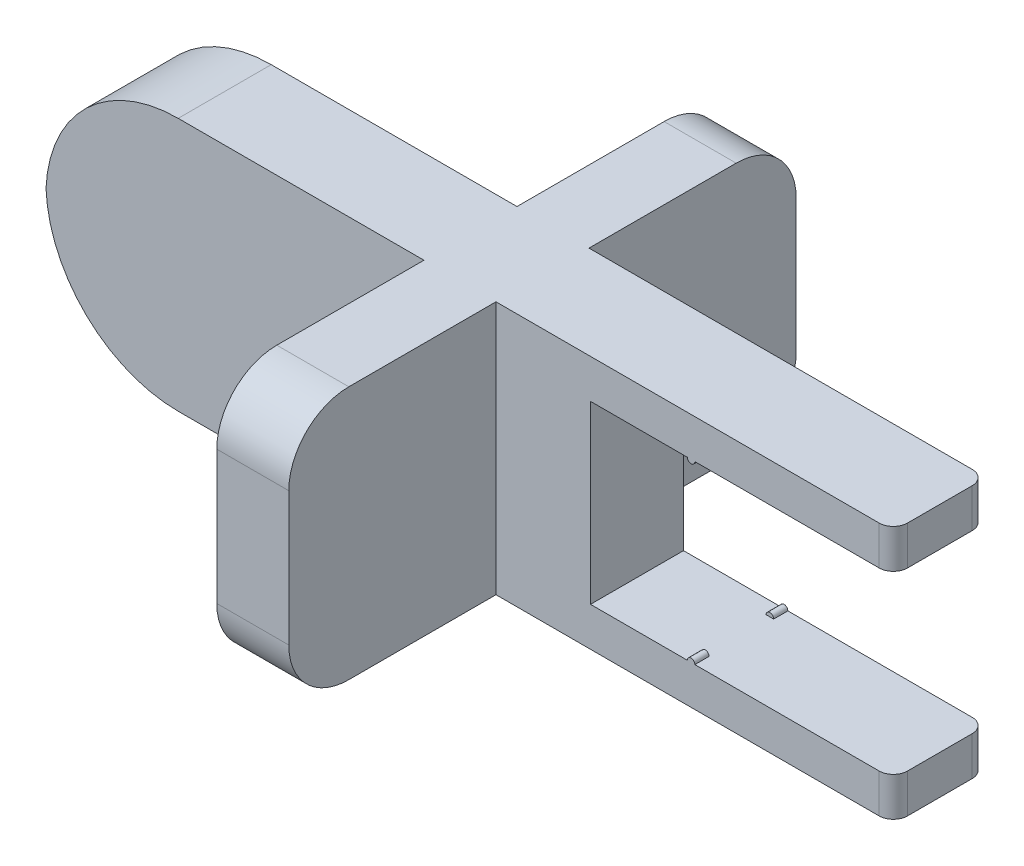
ISO-10303-21;
HEADER;
FILE_DESCRIPTION(('STEP AP214'),'2;1');
FILE_NAME('part.step','',(''),(''),'','','');
FILE_SCHEMA(('AUTOMOTIVE_DESIGN { 1 0 10303 214 1 1 1 1 }'));
ENDSEC;
DATA;
#1=APPLICATION_CONTEXT('core data for automotive mechanical design processes');
#2=APPLICATION_PROTOCOL_DEFINITION('international standard','automotive_design',2000,#1);
#3=PRODUCT_CONTEXT('',#1,'mechanical');
#4=PRODUCT('Part','Part','',(#3));
#5=PRODUCT_RELATED_PRODUCT_CATEGORY('part','',(#4));
#6=PRODUCT_DEFINITION_FORMATION('','',#4);
#7=PRODUCT_DEFINITION_CONTEXT('part definition',#1,'design');
#8=PRODUCT_DEFINITION('design','',#6,#7);
#9=PRODUCT_DEFINITION_SHAPE('','',#8);
#10=(LENGTH_UNIT() NAMED_UNIT(*) SI_UNIT(.MILLI.,.METRE.));
#11=(NAMED_UNIT(*) PLANE_ANGLE_UNIT() SI_UNIT($,.RADIAN.));
#12=(NAMED_UNIT(*) SI_UNIT($,.STERADIAN.) SOLID_ANGLE_UNIT());
#13=UNCERTAINTY_MEASURE_WITH_UNIT(LENGTH_MEASURE(1.E-05),#10,'distance_accuracy_value','');
#14=(GEOMETRIC_REPRESENTATION_CONTEXT(3) GLOBAL_UNCERTAINTY_ASSIGNED_CONTEXT((#13)) GLOBAL_UNIT_ASSIGNED_CONTEXT((#10,
#11,#12)) REPRESENTATION_CONTEXT('',''));
#15=CARTESIAN_POINT('',(0.,0.,0.));
#16=DIRECTION('',(0.,0.,1.));
#17=DIRECTION('',(1.,0.,0.));
#18=AXIS2_PLACEMENT_3D('',#15,#16,#17);
#19=CARTESIAN_POINT('',(-3.81,3.535,-7.785));
#20=DIRECTION('',(-1.,0.,0.));
#21=DIRECTION('',(0.,0.,1.));
#22=AXIS2_PLACEMENT_3D('',#19,#20,#21);
#23=PLANE('',#22);
#24=DIRECTION('',(0.,-1.,0.));
#25=VECTOR('',#24,1.);
#26=CARTESIAN_POINT('',(-3.81,-6.71,0.));
#27=LINE('',#26,#25);
#28=CARTESIAN_POINT('',(-3.81,6.71,0.));
#29=VERTEX_POINT('',#28);
#30=CARTESIAN_POINT('',(-3.81,-6.71,0.));
#31=VERTEX_POINT('',#30);
#32=EDGE_CURVE('E270',#29,#31,#27,.T.);
#33=ORIENTED_EDGE('',*,*,#32,.F.);
#34=DIRECTION('',(0.,0.,-1.));
#35=VECTOR('',#34,1.);
#36=CARTESIAN_POINT('',(-3.81,6.71,12.705));
#37=LINE('',#36,#35);
#38=CARTESIAN_POINT('',(-3.81,6.71,-7.78499999999998));
#39=VERTEX_POINT('',#38);
#40=EDGE_CURVE('E266',#29,#39,#37,.T.);
#41=ORIENTED_EDGE('',*,*,#40,.T.);
#42=CARTESIAN_POINT('',(-3.81,3.535,-7.785));
#43=DIRECTION('',(-1.,0.,0.));
#44=DIRECTION('',(0.,0.,1.));
#45=AXIS2_PLACEMENT_3D('',#42,#43,#44);
#46=CIRCLE('',#45,3.175);
#47=CARTESIAN_POINT('',(-3.81,3.53499999999998,-10.96));
#48=VERTEX_POINT('',#47);
#49=EDGE_CURVE('E280',#39,#48,#46,.T.);
#50=ORIENTED_EDGE('',*,*,#49,.T.);
#51=DIRECTION('',(0.,-1.,0.));
#52=VECTOR('',#51,1.);
#53=CARTESIAN_POINT('',(-3.81,-3.53499999999998,-10.96));
#54=LINE('',#53,#52);
#55=CARTESIAN_POINT('',(-3.81,-3.535,-10.96));
#56=VERTEX_POINT('',#55);
#57=EDGE_CURVE('E283',#48,#56,#54,.T.);
#58=ORIENTED_EDGE('',*,*,#57,.T.);
#59=CARTESIAN_POINT('',(-3.81,-3.535,-7.785));
#60=DIRECTION('',(-1.,0.,0.));
#61=DIRECTION('',(0.,0.,-1.));
#62=AXIS2_PLACEMENT_3D('',#59,#60,#61);
#63=CIRCLE('',#62,3.175);
#64=CARTESIAN_POINT('',(-3.81,-6.71,-7.78499999999998));
#65=VERTEX_POINT('',#64);
#66=EDGE_CURVE('E286',#56,#65,#63,.T.);
#67=ORIENTED_EDGE('',*,*,#66,.T.);
#68=DIRECTION('',(0.,0.,1.));
#69=VECTOR('',#68,1.);
#70=CARTESIAN_POINT('',(-3.81,-6.71,12.705));
#71=LINE('',#70,#69);
#72=EDGE_CURVE('E289',#65,#31,#71,.T.);
#73=ORIENTED_EDGE('',*,*,#72,.T.);
#74=EDGE_LOOP('',(#33,#41,#50,#58,#67,#73));
#75=FACE_BOUND('',#74,.T.);
#76=ADVANCED_FACE('F33',(#75),#23,.T.);
#77=CARTESIAN_POINT('',(10.32,-4.64999999999999,4.92));
#78=DIRECTION('',(0.,0.,-1.));
#79=DIRECTION('',(-1.,0.,0.));
#80=AXIS2_PLACEMENT_3D('',#77,#78,#79);
#81=CYLINDRICAL_SURFACE('',#80,0.199999999999996);
#82=CARTESIAN_POINT('',(10.32,-4.64999999999999,4.17));
#83=DIRECTION('',(0.,0.,1.));
#84=DIRECTION('',(1.,0.,0.));
#85=AXIS2_PLACEMENT_3D('',#82,#83,#84);
#86=CIRCLE('',#85,0.199999999999996);
#87=CARTESIAN_POINT('',(10.12,-4.64999999999998,4.17));
#88=VERTEX_POINT('',#87);
#89=CARTESIAN_POINT('',(10.52,-4.64999999999999,4.17));
#90=VERTEX_POINT('',#89);
#91=EDGE_CURVE('E353',#88,#90,#86,.F.);
#92=ORIENTED_EDGE('',*,*,#91,.F.);
#93=DIRECTION('',(0.,0.,-1.));
#94=VECTOR('',#93,1.);
#95=CARTESIAN_POINT('',(10.12,-4.64999999999999,4.92));
#96=LINE('',#95,#94);
#97=CARTESIAN_POINT('',(10.12,-4.64999999999999,4.92));
#98=VERTEX_POINT('',#97);
#99=EDGE_CURVE('E454',#98,#88,#96,.T.);
#100=ORIENTED_EDGE('',*,*,#99,.F.);
#101=CARTESIAN_POINT('',(10.32,-4.64999999999999,4.92));
#102=DIRECTION('',(0.,0.,-1.));
#103=DIRECTION('',(-1.,0.,0.));
#104=AXIS2_PLACEMENT_3D('',#101,#102,#103);
#105=CIRCLE('',#104,0.199999999999996);
#106=CARTESIAN_POINT('',(10.52,-4.64999999999999,4.92));
#107=VERTEX_POINT('',#106);
#108=EDGE_CURVE('E413',#98,#107,#105,.T.);
#109=ORIENTED_EDGE('',*,*,#108,.T.);
#110=DIRECTION('',(0.,0.,-1.));
#111=VECTOR('',#110,1.);
#112=CARTESIAN_POINT('',(10.52,-4.64999999999999,4.92));
#113=LINE('',#112,#111);
#114=EDGE_CURVE('E450',#107,#90,#113,.T.);
#115=ORIENTED_EDGE('',*,*,#114,.T.);
#116=EDGE_LOOP('',(#92,#100,#109,#115));
#117=FACE_BOUND('',#116,.T.);
#118=ADVANCED_FACE('F544',(#117),#81,.T.);
#119=CARTESIAN_POINT('',(10.32,4.64999999999999,4.92));
#120=DIRECTION('',(0.,0.,-1.));
#121=DIRECTION('',(-1.,0.,0.));
#122=AXIS2_PLACEMENT_3D('',#119,#120,#121);
#123=CYLINDRICAL_SURFACE('',#122,0.199999999999994);
#124=CARTESIAN_POINT('',(10.32,4.64999999999999,4.17));
#125=DIRECTION('',(0.,0.,1.));
#126=DIRECTION('',(1.,0.,0.));
#127=AXIS2_PLACEMENT_3D('',#124,#125,#126);
#128=CIRCLE('',#127,0.199999999999994);
#129=CARTESIAN_POINT('',(10.52,4.65000000000002,4.17));
#130=VERTEX_POINT('',#129);
#131=CARTESIAN_POINT('',(10.12,4.65000000000002,4.17));
#132=VERTEX_POINT('',#131);
#133=EDGE_CURVE('E351',#130,#132,#128,.F.);
#134=ORIENTED_EDGE('',*,*,#133,.F.);
#135=DIRECTION('',(0.,0.,-1.));
#136=VECTOR('',#135,1.);
#137=CARTESIAN_POINT('',(10.52,4.65,4.92));
#138=LINE('',#137,#136);
#139=CARTESIAN_POINT('',(10.52,4.65,4.92));
#140=VERTEX_POINT('',#139);
#141=EDGE_CURVE('E466',#140,#130,#138,.T.);
#142=ORIENTED_EDGE('',*,*,#141,.F.);
#143=CARTESIAN_POINT('',(10.32,4.64999999999999,4.92));
#144=DIRECTION('',(0.,0.,-1.));
#145=DIRECTION('',(-1.,0.,0.));
#146=AXIS2_PLACEMENT_3D('',#143,#144,#145);
#147=CIRCLE('',#146,0.199999999999994);
#148=CARTESIAN_POINT('',(10.12,4.64999999999999,4.92));
#149=VERTEX_POINT('',#148);
#150=EDGE_CURVE('E402',#140,#149,#147,.T.);
#151=ORIENTED_EDGE('',*,*,#150,.T.);
#152=DIRECTION('',(0.,0.,-1.));
#153=VECTOR('',#152,1.);
#154=CARTESIAN_POINT('',(10.12,4.64999999999999,4.92));
#155=LINE('',#154,#153);
#156=EDGE_CURVE('E462',#149,#132,#155,.T.);
#157=ORIENTED_EDGE('',*,*,#156,.T.);
#158=EDGE_LOOP('',(#134,#142,#151,#157));
#159=FACE_BOUND('',#158,.T.);
#160=ADVANCED_FACE('F562',(#159),#123,.T.);
#161=CARTESIAN_POINT('',(21.02,-4.64999999999999,4.92));
#162=DIRECTION('',(1.,0.,0.));
#163=DIRECTION('',(0.,1.,0.));
#164=AXIS2_PLACEMENT_3D('',#161,#162,#163);
#165=PLANE('',#164);
#166=DIRECTION('',(0.,1.,0.));
#167=VECTOR('',#166,1.);
#168=CARTESIAN_POINT('',(21.02,-19.9546229441366,0.75));
#169=LINE('',#168,#167);
#170=CARTESIAN_POINT('',(21.02,-6.70999999999999,0.75));
#171=VERTEX_POINT('',#170);
#172=CARTESIAN_POINT('',(21.02,-4.64999999999999,0.75));
#173=VERTEX_POINT('',#172);
#174=EDGE_CURVE('E376',#171,#173,#169,.T.);
#175=ORIENTED_EDGE('',*,*,#174,.T.);
#176=DIRECTION('',(0.,0.,-1.));
#177=VECTOR('',#176,1.);
#178=CARTESIAN_POINT('',(21.02,-4.64999999999999,4.92));
#179=LINE('',#178,#177);
#180=CARTESIAN_POINT('',(21.02,-4.64999999999999,4.17));
#181=VERTEX_POINT('',#180);
#182=EDGE_CURVE('E447',#181,#173,#179,.T.);
#183=ORIENTED_EDGE('',*,*,#182,.F.);
#184=DIRECTION('',(0.,1.,0.));
#185=VECTOR('',#184,1.);
#186=CARTESIAN_POINT('',(21.02,-19.9546229441366,4.17));
#187=LINE('',#186,#185);
#188=CARTESIAN_POINT('',(21.02,-6.70999999999999,4.17));
#189=VERTEX_POINT('',#188);
#190=EDGE_CURVE('E366',#189,#181,#187,.T.);
#191=ORIENTED_EDGE('',*,*,#190,.F.);
#192=DIRECTION('',(0.,0.,-1.));
#193=VECTOR('',#192,1.);
#194=CARTESIAN_POINT('',(21.02,-6.70999999999999,4.92));
#195=LINE('',#194,#193);
#196=EDGE_CURVE('E443',#189,#171,#195,.T.);
#197=ORIENTED_EDGE('',*,*,#196,.T.);
#198=EDGE_LOOP('',(#175,#183,#191,#197));
#199=FACE_BOUND('',#198,.T.);
#200=ADVANCED_FACE('F526',(#199),#165,.T.);
#201=CARTESIAN_POINT('',(21.02,6.71,4.92));
#202=DIRECTION('',(1.,0.,0.));
#203=DIRECTION('',(0.,1.,0.));
#204=AXIS2_PLACEMENT_3D('',#201,#202,#203);
#205=PLANE('',#204);
#206=CARTESIAN_POINT('',(21.02,4.65,0.75));
#207=VERTEX_POINT('',#206);
#208=CARTESIAN_POINT('',(21.02,6.71,0.75));
#209=VERTEX_POINT('',#208);
#210=EDGE_CURVE('E370',#207,#209,#169,.T.);
#211=ORIENTED_EDGE('',*,*,#210,.T.);
#212=DIRECTION('',(0.,0.,-1.));
#213=VECTOR('',#212,1.);
#214=CARTESIAN_POINT('',(21.02,6.71,4.92));
#215=LINE('',#214,#213);
#216=CARTESIAN_POINT('',(21.02,6.71,4.17));
#217=VERTEX_POINT('',#216);
#218=EDGE_CURVE('E418',#217,#209,#215,.T.);
#219=ORIENTED_EDGE('',*,*,#218,.F.);
#220=CARTESIAN_POINT('',(21.02,4.65,4.17));
#221=VERTEX_POINT('',#220);
#222=EDGE_CURVE('E375',#221,#217,#187,.T.);
#223=ORIENTED_EDGE('',*,*,#222,.F.);
#224=DIRECTION('',(0.,0.,-1.));
#225=VECTOR('',#224,1.);
#226=CARTESIAN_POINT('',(21.02,4.65,4.92));
#227=LINE('',#226,#225);
#228=EDGE_CURVE('E470',#221,#207,#227,.T.);
#229=ORIENTED_EDGE('',*,*,#228,.T.);
#230=EDGE_LOOP('',(#211,#219,#223,#229));
#231=FACE_BOUND('',#230,.T.);
#232=ADVANCED_FACE('F571',(#231),#205,.T.);
#233=CARTESIAN_POINT('',(10.32,4.64999999999999,0.));
#234=DIRECTION('',(0.,0.,-1.));
#235=DIRECTION('',(-1.,0.,0.));
#236=AXIS2_PLACEMENT_3D('',#233,#234,#235);
#237=PLANE('',#236);
#238=DIRECTION('',(1.,0.,0.));
#239=VECTOR('',#238,1.);
#240=CARTESIAN_POINT('',(10.52,-4.64999999999999,0.));
#241=LINE('',#240,#239);
#242=CARTESIAN_POINT('',(10.52,-4.64999999999999,0.));
#243=VERTEX_POINT('',#242);
#244=CARTESIAN_POINT('',(20.27,-4.64999999999999,0.));
#245=VERTEX_POINT('',#244);
#246=EDGE_CURVE('E395',#243,#245,#241,.T.);
#247=ORIENTED_EDGE('',*,*,#246,.T.);
#248=DIRECTION('',(0.,1.,0.));
#249=VECTOR('',#248,1.);
#250=CARTESIAN_POINT('',(20.27,-19.9546229441366,0.));
#251=LINE('',#250,#249);
#252=CARTESIAN_POINT('',(20.27,-6.70999999999999,0.));
#253=VERTEX_POINT('',#252);
#254=EDGE_CURVE('E360',#253,#245,#251,.T.);
#255=ORIENTED_EDGE('',*,*,#254,.F.);
#256=DIRECTION('',(-1.,0.,0.));
#257=VECTOR('',#256,1.);
#258=CARTESIAN_POINT('',(21.02,-6.70999999999999,0.));
#259=LINE('',#258,#257);
#260=CARTESIAN_POINT('',(0.,-6.71,0.));
#261=VERTEX_POINT('',#260);
#262=EDGE_CURVE('E391',#253,#261,#259,.T.);
#263=ORIENTED_EDGE('',*,*,#262,.T.);
#264=DIRECTION('',(0.,1.,0.));
#265=VECTOR('',#264,1.);
#266=CARTESIAN_POINT('',(0.,-6.71,0.));
#267=LINE('',#266,#265);
#268=CARTESIAN_POINT('',(0.,6.71,0.));
#269=VERTEX_POINT('',#268);
#270=EDGE_CURVE('E420',#261,#269,#267,.T.);
#271=ORIENTED_EDGE('',*,*,#270,.T.);
#272=DIRECTION('',(1.,0.,0.));
#273=VECTOR('',#272,1.);
#274=CARTESIAN_POINT('',(0.,6.71,0.));
#275=LINE('',#274,#273);
#276=CARTESIAN_POINT('',(20.27,6.71,0.));
#277=VERTEX_POINT('',#276);
#278=EDGE_CURVE('E423',#269,#277,#275,.T.);
#279=ORIENTED_EDGE('',*,*,#278,.T.);
#280=DIRECTION('',(0.,1.,0.));
#281=VECTOR('',#280,1.);
#282=CARTESIAN_POINT('',(20.27,-19.9546229441366,0.));
#283=LINE('',#282,#281);
#284=CARTESIAN_POINT('',(20.27,4.65,0.));
#285=VERTEX_POINT('',#284);
#286=EDGE_CURVE('E446',#277,#285,#283,.F.);
#287=ORIENTED_EDGE('',*,*,#286,.T.);
#288=DIRECTION('',(1.,0.,0.));
#289=VECTOR('',#288,1.);
#290=CARTESIAN_POINT('',(10.52,4.65,0.));
#291=LINE('',#290,#289);
#292=CARTESIAN_POINT('',(10.52,4.65,0.));
#293=VERTEX_POINT('',#292);
#294=EDGE_CURVE('E425',#293,#285,#291,.T.);
#295=ORIENTED_EDGE('',*,*,#294,.F.);
#296=CARTESIAN_POINT('',(10.32,4.64999999999999,0.));
#297=DIRECTION('',(0.,0.,-1.));
#298=DIRECTION('',(-1.,0.,0.));
#299=AXIS2_PLACEMENT_3D('',#296,#297,#298);
#300=CIRCLE('',#299,0.199999999999994);
#301=CARTESIAN_POINT('',(10.12,4.64999999999999,0.));
#302=VERTEX_POINT('',#301);
#303=EDGE_CURVE('E427',#293,#302,#300,.T.);
#304=ORIENTED_EDGE('',*,*,#303,.T.);
#305=DIRECTION('',(1.,0.,0.));
#306=VECTOR('',#305,1.);
#307=CARTESIAN_POINT('',(5.,4.65,0.));
#308=LINE('',#307,#306);
#309=CARTESIAN_POINT('',(5.,4.65,0.));
#310=VERTEX_POINT('',#309);
#311=EDGE_CURVE('E430',#310,#302,#308,.T.);
#312=ORIENTED_EDGE('',*,*,#311,.F.);
#313=DIRECTION('',(0.,-1.,0.));
#314=VECTOR('',#313,1.);
#315=CARTESIAN_POINT('',(5.,4.65,0.));
#316=LINE('',#315,#314);
#317=CARTESIAN_POINT('',(5.,-4.65,0.));
#318=VERTEX_POINT('',#317);
#319=EDGE_CURVE('E433',#310,#318,#316,.T.);
#320=ORIENTED_EDGE('',*,*,#319,.T.);
#321=DIRECTION('',(1.,0.,0.));
#322=VECTOR('',#321,1.);
#323=CARTESIAN_POINT('',(5.,-4.65,0.));
#324=LINE('',#323,#322);
#325=CARTESIAN_POINT('',(10.12,-4.64999999999999,0.));
#326=VERTEX_POINT('',#325);
#327=EDGE_CURVE('E436',#318,#326,#324,.T.);
#328=ORIENTED_EDGE('',*,*,#327,.T.);
#329=CARTESIAN_POINT('',(10.32,-4.64999999999999,0.));
#330=DIRECTION('',(0.,0.,-1.));
#331=DIRECTION('',(-1.,0.,0.));
#332=AXIS2_PLACEMENT_3D('',#329,#330,#331);
#333=CIRCLE('',#332,0.199999999999996);
#334=EDGE_CURVE('E439',#326,#243,#333,.T.);
#335=ORIENTED_EDGE('',*,*,#334,.T.);
#336=EDGE_LOOP('',(#247,#255,#263,#271,#279,#287,#295,#304,#312,#320,#328,#335));
#337=FACE_BOUND('',#336,.T.);
#338=ADVANCED_FACE('F519',(#337),#237,.T.);
#339=CARTESIAN_POINT('',(21.02,-6.70999999999999,4.92));
#340=DIRECTION('',(0.,-1.,0.));
#341=DIRECTION('',(1.,0.,0.));
#342=AXIS2_PLACEMENT_3D('',#339,#340,#341);
#343=PLANE('',#342);
#344=DIRECTION('',(1.,0.,0.));
#345=VECTOR('',#344,1.);
#346=CARTESIAN_POINT('',(-23.81,-6.71,4.92));
#347=LINE('',#346,#345);
#348=CARTESIAN_POINT('',(-16.81,-6.71,4.92));
#349=VERTEX_POINT('',#348);
#350=CARTESIAN_POINT('',(-3.81,-6.71,4.92));
#351=VERTEX_POINT('',#350);
#352=EDGE_CURVE('E254',#349,#351,#347,.T.);
#353=ORIENTED_EDGE('',*,*,#352,.F.);
#354=DIRECTION('',(0.,0.,1.));
#355=VECTOR('',#354,1.);
#356=CARTESIAN_POINT('',(-16.81,-6.71,0.));
#357=LINE('',#356,#355);
#358=CARTESIAN_POINT('',(-16.81,-6.71,0.));
#359=VERTEX_POINT('',#358);
#360=EDGE_CURVE('E484',#349,#359,#357,.F.);
#361=ORIENTED_EDGE('',*,*,#360,.T.);
#362=DIRECTION('',(1.,0.,0.));
#363=VECTOR('',#362,1.);
#364=CARTESIAN_POINT('',(-23.81,-6.71,0.));
#365=LINE('',#364,#363);
#366=EDGE_CURVE('E277',#359,#31,#365,.T.);
#367=ORIENTED_EDGE('',*,*,#366,.T.);
#368=ORIENTED_EDGE('',*,*,#72,.F.);
#369=DIRECTION('',(1.,0.,0.));
#370=VECTOR('',#369,1.);
#371=CARTESIAN_POINT('',(-3.81,-6.71,-7.78499999999998));
#372=LINE('',#371,#370);
#373=CARTESIAN_POINT('',(0.,-6.71,-7.78499999999998));
#374=VERTEX_POINT('',#373);
#375=EDGE_CURVE('E329',#65,#374,#372,.T.);
#376=ORIENTED_EDGE('',*,*,#375,.T.);
#377=DIRECTION('',(0.,0.,1.));
#378=VECTOR('',#377,1.);
#379=CARTESIAN_POINT('',(0.,-6.71,12.705));
#380=LINE('',#379,#378);
#381=EDGE_CURVE('E304',#374,#261,#380,.T.);
#382=ORIENTED_EDGE('',*,*,#381,.T.);
#383=ORIENTED_EDGE('',*,*,#262,.F.);
#384=CARTESIAN_POINT('',(20.27,-6.70999999999999,0.75));
#385=DIRECTION('',(0.,-1.,0.));
#386=DIRECTION('',(1.,0.,0.));
#387=AXIS2_PLACEMENT_3D('',#384,#385,#386);
#388=CIRCLE('',#387,0.75);
#389=EDGE_CURVE('E367',#253,#171,#388,.T.);
#390=ORIENTED_EDGE('',*,*,#389,.T.);
#391=ORIENTED_EDGE('',*,*,#196,.F.);
#392=CARTESIAN_POINT('',(20.27,-6.70999999999999,4.17));
#393=DIRECTION('',(0.,-1.,0.));
#394=DIRECTION('',(1.,0.,0.));
#395=AXIS2_PLACEMENT_3D('',#392,#393,#394);
#396=CIRCLE('',#395,0.75);
#397=CARTESIAN_POINT('',(20.27,-6.70999999999999,4.92));
#398=VERTEX_POINT('',#397);
#399=EDGE_CURVE('E362',#189,#398,#396,.T.);
#400=ORIENTED_EDGE('',*,*,#399,.T.);
#401=DIRECTION('',(-1.,0.,0.));
#402=VECTOR('',#401,1.);
#403=CARTESIAN_POINT('',(21.02,-6.70999999999999,4.92));
#404=LINE('',#403,#402);
#405=CARTESIAN_POINT('',(0.,-6.71,4.92));
#406=VERTEX_POINT('',#405);
#407=EDGE_CURVE('E392',#398,#406,#404,.T.);
#408=ORIENTED_EDGE('',*,*,#407,.T.);
#409=CARTESIAN_POINT('',(0.,-6.71,12.705));
#410=VERTEX_POINT('',#409);
#411=EDGE_CURVE('E303',#406,#410,#380,.T.);
#412=ORIENTED_EDGE('',*,*,#411,.T.);
#413=DIRECTION('',(1.,0.,0.));
#414=VECTOR('',#413,1.);
#415=CARTESIAN_POINT('',(-3.81,-6.71,12.705));
#416=LINE('',#415,#414);
#417=CARTESIAN_POINT('',(-3.81,-6.71,12.705));
#418=VERTEX_POINT('',#417);
#419=EDGE_CURVE('E326',#418,#410,#416,.T.);
#420=ORIENTED_EDGE('',*,*,#419,.F.);
#421=EDGE_CURVE('E288',#351,#418,#71,.T.);
#422=ORIENTED_EDGE('',*,*,#421,.F.);
#423=EDGE_LOOP('',(#353,#361,#367,#368,#376,#382,#383,#390,#391,#400,#408,#412,#420,#422));
#424=FACE_BOUND('',#423,.T.);
#425=ADVANCED_FACE('F490',(#424),#343,.T.);
#426=CARTESIAN_POINT('',(10.52,-4.64999999999999,4.92));
#427=DIRECTION('',(0.,1.,0.));
#428=DIRECTION('',(-1.,0.,0.));
#429=AXIS2_PLACEMENT_3D('',#426,#427,#428);
#430=PLANE('',#429);
#431=CARTESIAN_POINT('',(10.52,-4.64999999999998,0.75));
#432=VERTEX_POINT('',#431);
#433=EDGE_CURVE('E453',#432,#243,#113,.T.);
#434=ORIENTED_EDGE('',*,*,#433,.F.);
#435=DIRECTION('',(1.,0.,0.));
#436=VECTOR('',#435,1.);
#437=CARTESIAN_POINT('',(-4.90890508583063,-4.64999999999995,0.75));
#438=LINE('',#437,#436);
#439=CARTESIAN_POINT('',(10.12,-4.64999999999998,0.75));
#440=VERTEX_POINT('',#439);
#441=EDGE_CURVE('E345',#440,#432,#438,.T.);
#442=ORIENTED_EDGE('',*,*,#441,.F.);
#443=EDGE_CURVE('E457',#440,#326,#96,.T.);
#444=ORIENTED_EDGE('',*,*,#443,.T.);
#445=ORIENTED_EDGE('',*,*,#327,.F.);
#446=DIRECTION('',(0.,0.,-1.));
#447=VECTOR('',#446,1.);
#448=CARTESIAN_POINT('',(5.,-4.65,4.92));
#449=LINE('',#448,#447);
#450=CARTESIAN_POINT('',(5.,-4.65,4.92));
#451=VERTEX_POINT('',#450);
#452=EDGE_CURVE('E458',#451,#318,#449,.T.);
#453=ORIENTED_EDGE('',*,*,#452,.F.);
#454=DIRECTION('',(1.,0.,0.));
#455=VECTOR('',#454,1.);
#456=CARTESIAN_POINT('',(5.,-4.65,4.92));
#457=LINE('',#456,#455);
#458=EDGE_CURVE('E410',#451,#98,#457,.T.);
#459=ORIENTED_EDGE('',*,*,#458,.T.);
#460=ORIENTED_EDGE('',*,*,#99,.T.);
#461=DIRECTION('',(1.,0.,0.));
#462=VECTOR('',#461,1.);
#463=CARTESIAN_POINT('',(-4.90890508583063,-4.64999999999995,4.17));
#464=LINE('',#463,#462);
#465=EDGE_CURVE('E338',#88,#90,#464,.T.);
#466=ORIENTED_EDGE('',*,*,#465,.T.);
#467=ORIENTED_EDGE('',*,*,#114,.F.);
#468=DIRECTION('',(1.,0.,0.));
#469=VECTOR('',#468,1.);
#470=CARTESIAN_POINT('',(10.52,-4.64999999999999,4.92));
#471=LINE('',#470,#469);
#472=CARTESIAN_POINT('',(20.27,-4.64999999999999,4.92));
#473=VERTEX_POINT('',#472);
#474=EDGE_CURVE('E416',#107,#473,#471,.T.);
#475=ORIENTED_EDGE('',*,*,#474,.T.);
#476=CARTESIAN_POINT('',(20.27,-4.64999999999999,4.17));
#477=DIRECTION('',(0.,1.,0.));
#478=DIRECTION('',(-1.,0.,0.));
#479=AXIS2_PLACEMENT_3D('',#476,#477,#478);
#480=CIRCLE('',#479,0.75);
#481=EDGE_CURVE('E388',#181,#473,#480,.F.);
#482=ORIENTED_EDGE('',*,*,#481,.F.);
#483=ORIENTED_EDGE('',*,*,#182,.T.);
#484=CARTESIAN_POINT('',(20.27,-4.64999999999999,0.75));
#485=DIRECTION('',(0.,1.,0.));
#486=DIRECTION('',(-1.,0.,0.));
#487=AXIS2_PLACEMENT_3D('',#484,#485,#486);
#488=CIRCLE('',#487,0.75);
#489=EDGE_CURVE('E383',#245,#173,#488,.F.);
#490=ORIENTED_EDGE('',*,*,#489,.F.);
#491=ORIENTED_EDGE('',*,*,#246,.F.);
#492=EDGE_LOOP('',(#434,#442,#444,#445,#453,#459,#460,#466,#467,#475,#482,#483,#490,#491));
#493=FACE_BOUND('',#492,.T.);
#494=ADVANCED_FACE('F533',(#493),#430,.T.);
#495=CARTESIAN_POINT('',(10.32,-4.64999999999999,0.75));
#496=DIRECTION('',(0.,0.,-1.));
#497=DIRECTION('',(-1.,0.,0.));
#498=AXIS2_PLACEMENT_3D('',#495,#496,#497);
#499=CIRCLE('',#498,0.199999999999996);
#500=EDGE_CURVE('E349',#432,#440,#499,.F.);
#501=ORIENTED_EDGE('',*,*,#500,.F.);
#502=ORIENTED_EDGE('',*,*,#433,.T.);
#503=ORIENTED_EDGE('',*,*,#334,.F.);
#504=ORIENTED_EDGE('',*,*,#443,.F.);
#505=EDGE_LOOP('',(#501,#502,#503,#504));
#506=FACE_BOUND('',#505,.T.);
#507=ADVANCED_FACE('F605',(#506),#81,.T.);
#508=CARTESIAN_POINT('',(5.,4.65,4.92));
#509=DIRECTION('',(1.,0.,0.));
#510=DIRECTION('',(0.,1.,0.));
#511=AXIS2_PLACEMENT_3D('',#508,#509,#510);
#512=PLANE('',#511);
#513=ORIENTED_EDGE('',*,*,#319,.F.);
#514=DIRECTION('',(0.,0.,-1.));
#515=VECTOR('',#514,1.);
#516=CARTESIAN_POINT('',(5.,4.65,4.92));
#517=LINE('',#516,#515);
#518=CARTESIAN_POINT('',(5.,4.65,4.92));
#519=VERTEX_POINT('',#518);
#520=EDGE_CURVE('E460',#519,#310,#517,.T.);
#521=ORIENTED_EDGE('',*,*,#520,.F.);
#522=DIRECTION('',(0.,-1.,0.));
#523=VECTOR('',#522,1.);
#524=CARTESIAN_POINT('',(5.,4.65,4.92));
#525=LINE('',#524,#523);
#526=EDGE_CURVE('E407',#519,#451,#525,.T.);
#527=ORIENTED_EDGE('',*,*,#526,.T.);
#528=ORIENTED_EDGE('',*,*,#452,.T.);
#529=EDGE_LOOP('',(#513,#521,#527,#528));
#530=FACE_BOUND('',#529,.T.);
#531=ADVANCED_FACE('F549',(#530),#512,.T.);
#532=CARTESIAN_POINT('',(5.,4.65,4.92));
#533=DIRECTION('',(0.,1.,0.));
#534=DIRECTION('',(-1.,0.,0.));
#535=AXIS2_PLACEMENT_3D('',#532,#533,#534);
#536=PLANE('',#535);
#537=CARTESIAN_POINT('',(10.12,4.64999999999999,0.75));
#538=VERTEX_POINT('',#537);
#539=EDGE_CURVE('E465',#538,#302,#155,.T.);
#540=ORIENTED_EDGE('',*,*,#539,.F.);
#541=DIRECTION('',(1.,0.,0.));
#542=VECTOR('',#541,1.);
#543=CARTESIAN_POINT('',(-4.90890508583061,4.65000000000004,0.75));
#544=LINE('',#543,#542);
#545=CARTESIAN_POINT('',(10.52,4.65000000000002,0.75));
#546=VERTEX_POINT('',#545);
#547=EDGE_CURVE('E342',#538,#546,#544,.T.);
#548=ORIENTED_EDGE('',*,*,#547,.T.);
#549=EDGE_CURVE('E469',#546,#293,#138,.T.);
#550=ORIENTED_EDGE('',*,*,#549,.T.);
#551=ORIENTED_EDGE('',*,*,#294,.T.);
#552=CARTESIAN_POINT('',(20.27,4.65,0.75));
#553=DIRECTION('',(0.,1.,0.));
#554=DIRECTION('',(-1.,0.,0.));
#555=AXIS2_PLACEMENT_3D('',#552,#553,#554);
#556=CIRCLE('',#555,0.75);
#557=EDGE_CURVE('E373',#285,#207,#556,.F.);
#558=ORIENTED_EDGE('',*,*,#557,.T.);
#559=ORIENTED_EDGE('',*,*,#228,.F.);
#560=CARTESIAN_POINT('',(20.27,4.65,4.17));
#561=DIRECTION('',(0.,1.,0.));
#562=DIRECTION('',(-1.,0.,0.));
#563=AXIS2_PLACEMENT_3D('',#560,#561,#562);
#564=CIRCLE('',#563,0.75);
#565=CARTESIAN_POINT('',(20.27,4.65,4.92));
#566=VERTEX_POINT('',#565);
#567=EDGE_CURVE('E385',#221,#566,#564,.F.);
#568=ORIENTED_EDGE('',*,*,#567,.T.);
#569=DIRECTION('',(1.,0.,0.));
#570=VECTOR('',#569,1.);
#571=CARTESIAN_POINT('',(10.52,4.65,4.92));
#572=LINE('',#571,#570);
#573=EDGE_CURVE('E400',#140,#566,#572,.T.);
#574=ORIENTED_EDGE('',*,*,#573,.F.);
#575=ORIENTED_EDGE('',*,*,#141,.T.);
#576=DIRECTION('',(1.,0.,0.));
#577=VECTOR('',#576,1.);
#578=CARTESIAN_POINT('',(-4.90890508583061,4.65000000000004,4.17));
#579=LINE('',#578,#577);
#580=EDGE_CURVE('E339',#132,#130,#579,.T.);
#581=ORIENTED_EDGE('',*,*,#580,.F.);
#582=ORIENTED_EDGE('',*,*,#156,.F.);
#583=DIRECTION('',(1.,0.,0.));
#584=VECTOR('',#583,1.);
#585=CARTESIAN_POINT('',(5.,4.65,4.92));
#586=LINE('',#585,#584);
#587=EDGE_CURVE('E405',#519,#149,#586,.T.);
#588=ORIENTED_EDGE('',*,*,#587,.F.);
#589=ORIENTED_EDGE('',*,*,#520,.T.);
#590=ORIENTED_EDGE('',*,*,#311,.T.);
#591=EDGE_LOOP('',(#540,#548,#550,#551,#558,#559,#568,#574,#575,#581,#582,#588,#589,#590));
#592=FACE_BOUND('',#591,.T.);
#593=ADVANCED_FACE('F555',(#592),#536,.F.);
#594=CARTESIAN_POINT('',(10.32,4.64999999999999,0.75));
#595=DIRECTION('',(0.,0.,-1.));
#596=DIRECTION('',(-1.,0.,0.));
#597=AXIS2_PLACEMENT_3D('',#594,#595,#596);
#598=CIRCLE('',#597,0.199999999999994);
#599=EDGE_CURVE('E341',#538,#546,#598,.F.);
#600=ORIENTED_EDGE('',*,*,#599,.F.);
#601=ORIENTED_EDGE('',*,*,#539,.T.);
#602=ORIENTED_EDGE('',*,*,#303,.F.);
#603=ORIENTED_EDGE('',*,*,#549,.F.);
#604=EDGE_LOOP('',(#600,#601,#602,#603));
#605=FACE_BOUND('',#604,.T.);
#606=ADVANCED_FACE('F724',(#605),#123,.T.);
#607=CARTESIAN_POINT('',(0.,6.71,4.92));
#608=DIRECTION('',(0.,1.,0.));
#609=DIRECTION('',(-1.,0.,0.));
#610=AXIS2_PLACEMENT_3D('',#607,#608,#609);
#611=PLANE('',#610);
#612=DIRECTION('',(1.,0.,0.));
#613=VECTOR('',#612,1.);
#614=CARTESIAN_POINT('',(-23.81,6.71,0.));
#615=LINE('',#614,#613);
#616=CARTESIAN_POINT('',(-16.81,6.71,0.));
#617=VERTEX_POINT('',#616);
#618=EDGE_CURVE('E255',#617,#29,#615,.T.);
#619=ORIENTED_EDGE('',*,*,#618,.F.);
#620=DIRECTION('',(0.,0.,-1.));
#621=VECTOR('',#620,1.);
#622=CARTESIAN_POINT('',(-16.81,6.71,4.92));
#623=LINE('',#622,#621);
#624=CARTESIAN_POINT('',(-16.81,6.71,4.92));
#625=VERTEX_POINT('',#624);
#626=EDGE_CURVE('E11',#617,#625,#623,.F.);
#627=ORIENTED_EDGE('',*,*,#626,.T.);
#628=DIRECTION('',(1.,0.,0.));
#629=VECTOR('',#628,1.);
#630=CARTESIAN_POINT('',(-23.81,6.71,4.92));
#631=LINE('',#630,#629);
#632=CARTESIAN_POINT('',(-3.81,6.71,4.92));
#633=VERTEX_POINT('',#632);
#634=EDGE_CURVE('E245',#625,#633,#631,.T.);
#635=ORIENTED_EDGE('',*,*,#634,.T.);
#636=CARTESIAN_POINT('',(-3.81,6.71,12.705));
#637=VERTEX_POINT('',#636);
#638=EDGE_CURVE('E249',#637,#633,#37,.T.);
#639=ORIENTED_EDGE('',*,*,#638,.F.);
#640=DIRECTION('',(1.,0.,0.));
#641=VECTOR('',#640,1.);
#642=CARTESIAN_POINT('',(-3.81,6.71,12.705));
#643=LINE('',#642,#641);
#644=CARTESIAN_POINT('',(0.,6.71,12.705));
#645=VERTEX_POINT('',#644);
#646=EDGE_CURVE('E318',#637,#645,#643,.T.);
#647=ORIENTED_EDGE('',*,*,#646,.T.);
#648=DIRECTION('',(0.,0.,-1.));
#649=VECTOR('',#648,1.);
#650=CARTESIAN_POINT('',(0.,6.71,12.705));
#651=LINE('',#650,#649);
#652=CARTESIAN_POINT('',(0.,6.71,4.92));
#653=VERTEX_POINT('',#652);
#654=EDGE_CURVE('E284',#645,#653,#651,.T.);
#655=ORIENTED_EDGE('',*,*,#654,.T.);
#656=DIRECTION('',(1.,0.,0.));
#657=VECTOR('',#656,1.);
#658=CARTESIAN_POINT('',(0.,6.71,4.92));
#659=LINE('',#658,#657);
#660=CARTESIAN_POINT('',(20.27,6.71,4.92));
#661=VERTEX_POINT('',#660);
#662=EDGE_CURVE('E398',#653,#661,#659,.T.);
#663=ORIENTED_EDGE('',*,*,#662,.T.);
#664=CARTESIAN_POINT('',(20.27,6.71,4.17));
#665=DIRECTION('',(0.,-1.,0.));
#666=DIRECTION('',(-1.,0.,0.));
#667=AXIS2_PLACEMENT_3D('',#664,#665,#666);
#668=CIRCLE('',#667,0.75);
#669=EDGE_CURVE('E357',#217,#661,#668,.T.);
#670=ORIENTED_EDGE('',*,*,#669,.F.);
#671=ORIENTED_EDGE('',*,*,#218,.T.);
#672=CARTESIAN_POINT('',(20.27,6.71,0.75));
#673=DIRECTION('',(0.,-1.,0.));
#674=DIRECTION('',(-1.,0.,0.));
#675=AXIS2_PLACEMENT_3D('',#672,#673,#674);
#676=CIRCLE('',#675,0.75);
#677=EDGE_CURVE('E356',#277,#209,#676,.T.);
#678=ORIENTED_EDGE('',*,*,#677,.F.);
#679=ORIENTED_EDGE('',*,*,#278,.F.);
#680=CARTESIAN_POINT('',(0.,6.71,-7.78499999999998));
#681=VERTEX_POINT('',#680);
#682=EDGE_CURVE('E313',#269,#681,#651,.T.);
#683=ORIENTED_EDGE('',*,*,#682,.T.);
#684=DIRECTION('',(1.,0.,0.));
#685=VECTOR('',#684,1.);
#686=CARTESIAN_POINT('',(-3.81,6.71,-7.78499999999998));
#687=LINE('',#686,#685);
#688=EDGE_CURVE('E265',#39,#681,#687,.T.);
#689=ORIENTED_EDGE('',*,*,#688,.F.);
#690=ORIENTED_EDGE('',*,*,#40,.F.);
#691=EDGE_LOOP('',(#619,#627,#635,#639,#647,#655,#663,#670,#671,#678,#679,#683,#689,#690));
#692=FACE_BOUND('',#691,.T.);
#693=ADVANCED_FACE('F247',(#692),#611,.T.);
#694=CARTESIAN_POINT('',(10.32,4.64999999999999,4.92));
#695=DIRECTION('',(0.,0.,-1.));
#696=DIRECTION('',(-1.,0.,0.));
#697=AXIS2_PLACEMENT_3D('',#694,#695,#696);
#698=PLANE('',#697);
#699=DIRECTION('',(0.,1.,0.));
#700=VECTOR('',#699,1.);
#701=CARTESIAN_POINT('',(0.,-6.71,4.92));
#702=LINE('',#701,#700);
#703=EDGE_CURVE('E394',#406,#653,#702,.T.);
#704=ORIENTED_EDGE('',*,*,#703,.F.);
#705=ORIENTED_EDGE('',*,*,#407,.F.);
#706=DIRECTION('',(0.,1.,0.));
#707=VECTOR('',#706,1.);
#708=CARTESIAN_POINT('',(20.27,-19.9546229441366,4.92));
#709=LINE('',#708,#707);
#710=EDGE_CURVE('E365',#398,#473,#709,.T.);
#711=ORIENTED_EDGE('',*,*,#710,.T.);
#712=ORIENTED_EDGE('',*,*,#474,.F.);
#713=ORIENTED_EDGE('',*,*,#108,.F.);
#714=ORIENTED_EDGE('',*,*,#458,.F.);
#715=ORIENTED_EDGE('',*,*,#526,.F.);
#716=ORIENTED_EDGE('',*,*,#587,.T.);
#717=ORIENTED_EDGE('',*,*,#150,.F.);
#718=ORIENTED_EDGE('',*,*,#573,.T.);
#719=DIRECTION('',(0.,1.,0.));
#720=VECTOR('',#719,1.);
#721=CARTESIAN_POINT('',(20.27,-19.9546229441366,4.92));
#722=LINE('',#721,#720);
#723=EDGE_CURVE('E477',#661,#566,#722,.F.);
#724=ORIENTED_EDGE('',*,*,#723,.F.);
#725=ORIENTED_EDGE('',*,*,#662,.F.);
#726=EDGE_LOOP('',(#704,#705,#711,#712,#713,#714,#715,#716,#717,#718,#724,#725));
#727=FACE_BOUND('',#726,.T.);
#728=ADVANCED_FACE('F539',(#727),#698,.F.);
#729=CARTESIAN_POINT('',(20.27,-19.9546229441366,0.75));
#730=DIRECTION('',(0.,1.,0.));
#731=DIRECTION('',(-1.,0.,0.));
#732=AXIS2_PLACEMENT_3D('',#729,#730,#731);
#733=CYLINDRICAL_SURFACE('',#732,0.75);
#734=ORIENTED_EDGE('',*,*,#489,.T.);
#735=ORIENTED_EDGE('',*,*,#174,.F.);
#736=ORIENTED_EDGE('',*,*,#389,.F.);
#737=ORIENTED_EDGE('',*,*,#254,.T.);
#738=EDGE_LOOP('',(#734,#735,#736,#737));
#739=FACE_BOUND('',#738,.T.);
#740=ADVANCED_FACE('F666',(#739),#733,.T.);
#741=ORIENTED_EDGE('',*,*,#286,.F.);
#742=ORIENTED_EDGE('',*,*,#677,.T.);
#743=ORIENTED_EDGE('',*,*,#210,.F.);
#744=ORIENTED_EDGE('',*,*,#557,.F.);
#745=EDGE_LOOP('',(#741,#742,#743,#744));
#746=FACE_BOUND('',#745,.T.);
#747=ADVANCED_FACE('F794',(#746),#733,.T.);
#748=CARTESIAN_POINT('',(20.27,-19.9546229441366,4.17));
#749=DIRECTION('',(0.,1.,0.));
#750=DIRECTION('',(-1.,0.,0.));
#751=AXIS2_PLACEMENT_3D('',#748,#749,#750);
#752=CYLINDRICAL_SURFACE('',#751,0.75);
#753=ORIENTED_EDGE('',*,*,#481,.T.);
#754=ORIENTED_EDGE('',*,*,#710,.F.);
#755=ORIENTED_EDGE('',*,*,#399,.F.);
#756=ORIENTED_EDGE('',*,*,#190,.T.);
#757=EDGE_LOOP('',(#753,#754,#755,#756));
#758=FACE_BOUND('',#757,.T.);
#759=ADVANCED_FACE('F530',(#758),#752,.T.);
#760=ORIENTED_EDGE('',*,*,#222,.T.);
#761=ORIENTED_EDGE('',*,*,#669,.T.);
#762=ORIENTED_EDGE('',*,*,#723,.T.);
#763=ORIENTED_EDGE('',*,*,#567,.F.);
#764=EDGE_LOOP('',(#760,#761,#762,#763));
#765=FACE_BOUND('',#764,.T.);
#766=ADVANCED_FACE('F566',(#765),#752,.T.);
#767=CARTESIAN_POINT('',(-4.90890508583061,4.65000000000004,0.75));
#768=DIRECTION('',(0.,0.,-1.));
#769=DIRECTION('',(-1.,0.,0.));
#770=AXIS2_PLACEMENT_3D('',#767,#768,#769);
#771=PLANE('',#770);
#772=ORIENTED_EDGE('',*,*,#599,.T.);
#773=ORIENTED_EDGE('',*,*,#547,.F.);
#774=EDGE_LOOP('',(#772,#773));
#775=FACE_BOUND('',#774,.T.);
#776=ADVANCED_FACE('F691',(#775),#771,.F.);
#777=CARTESIAN_POINT('',(-4.90890508583061,4.65000000000004,4.17));
#778=DIRECTION('',(0.,0.,1.));
#779=DIRECTION('',(1.,0.,0.));
#780=AXIS2_PLACEMENT_3D('',#777,#778,#779);
#781=PLANE('',#780);
#782=ORIENTED_EDGE('',*,*,#133,.T.);
#783=ORIENTED_EDGE('',*,*,#580,.T.);
#784=EDGE_LOOP('',(#782,#783));
#785=FACE_BOUND('',#784,.T.);
#786=ADVANCED_FACE('F700',(#785),#781,.F.);
#787=ORIENTED_EDGE('',*,*,#91,.T.);
#788=ORIENTED_EDGE('',*,*,#465,.F.);
#789=EDGE_LOOP('',(#787,#788));
#790=FACE_BOUND('',#789,.T.);
#791=ADVANCED_FACE('F688',(#790),#781,.F.);
#792=ORIENTED_EDGE('',*,*,#500,.T.);
#793=ORIENTED_EDGE('',*,*,#441,.T.);
#794=EDGE_LOOP('',(#792,#793));
#795=FACE_BOUND('',#794,.T.);
#796=ADVANCED_FACE('F656',(#795),#771,.F.);
#797=CARTESIAN_POINT('',(0.,3.535,-7.785));
#798=DIRECTION('',(-1.,0.,0.));
#799=DIRECTION('',(0.,0.,1.));
#800=AXIS2_PLACEMENT_3D('',#797,#798,#799);
#801=PLANE('',#800);
#802=ORIENTED_EDGE('',*,*,#411,.F.);
#803=ORIENTED_EDGE('',*,*,#703,.T.);
#804=ORIENTED_EDGE('',*,*,#654,.F.);
#805=CARTESIAN_POINT('',(0.,3.53500000000001,12.705));
#806=DIRECTION('',(-1.,0.,0.));
#807=DIRECTION('',(0.,0.,1.));
#808=AXIS2_PLACEMENT_3D('',#805,#806,#807);
#809=CIRCLE('',#808,3.175);
#810=CARTESIAN_POINT('',(0.,3.53499999999998,15.88));
#811=VERTEX_POINT('',#810);
#812=EDGE_CURVE('E311',#811,#645,#809,.T.);
#813=ORIENTED_EDGE('',*,*,#812,.F.);
#814=DIRECTION('',(0.,1.,0.));
#815=VECTOR('',#814,1.);
#816=CARTESIAN_POINT('',(0.,-3.53499999999997,15.88));
#817=LINE('',#816,#815);
#818=CARTESIAN_POINT('',(0.,-3.53499999999997,15.88));
#819=VERTEX_POINT('',#818);
#820=EDGE_CURVE('E309',#819,#811,#817,.T.);
#821=ORIENTED_EDGE('',*,*,#820,.F.);
#822=CARTESIAN_POINT('',(0.,-3.535,12.705));
#823=DIRECTION('',(-1.,0.,0.));
#824=DIRECTION('',(0.,0.,1.));
#825=AXIS2_PLACEMENT_3D('',#822,#823,#824);
#826=CIRCLE('',#825,3.175);
#827=EDGE_CURVE('E307',#410,#819,#826,.T.);
#828=ORIENTED_EDGE('',*,*,#827,.F.);
#829=EDGE_LOOP('',(#802,#803,#804,#813,#821,#828));
#830=FACE_BOUND('',#829,.T.);
#831=ADVANCED_FACE('F576',(#830),#801,.F.);
#832=CARTESIAN_POINT('',(-3.81,3.535,-7.785));
#833=DIRECTION('',(1.,0.,0.));
#834=DIRECTION('',(0.,0.,-1.));
#835=AXIS2_PLACEMENT_3D('',#832,#833,#834);
#836=CYLINDRICAL_SURFACE('',#835,3.175);
#837=CARTESIAN_POINT('',(0.,3.535,-7.785));
#838=DIRECTION('',(-1.,0.,0.));
#839=DIRECTION('',(0.,0.,1.));
#840=AXIS2_PLACEMENT_3D('',#837,#838,#839);
#841=CIRCLE('',#840,3.175);
#842=CARTESIAN_POINT('',(0.,3.53499999999998,-10.96));
#843=VERTEX_POINT('',#842);
#844=EDGE_CURVE('E279',#681,#843,#841,.T.);
#845=ORIENTED_EDGE('',*,*,#844,.T.);
#846=DIRECTION('',(1.,0.,0.));
#847=VECTOR('',#846,1.);
#848=CARTESIAN_POINT('',(-3.81,3.53499999999998,-10.96));
#849=LINE('',#848,#847);
#850=EDGE_CURVE('E335',#48,#843,#849,.T.);
#851=ORIENTED_EDGE('',*,*,#850,.F.);
#852=ORIENTED_EDGE('',*,*,#49,.F.);
#853=ORIENTED_EDGE('',*,*,#688,.T.);
#854=EDGE_LOOP('',(#845,#851,#852,#853));
#855=FACE_BOUND('',#854,.T.);
#856=ADVANCED_FACE('F504',(#855),#836,.T.);
#857=CARTESIAN_POINT('',(-3.81,-3.53499999999998,-10.96));
#858=DIRECTION('',(0.,0.,1.));
#859=DIRECTION('',(1.,0.,0.));
#860=AXIS2_PLACEMENT_3D('',#857,#858,#859);
#861=PLANE('',#860);
#862=DIRECTION('',(0.,-1.,0.));
#863=VECTOR('',#862,1.);
#864=CARTESIAN_POINT('',(0.,-3.53499999999998,-10.96));
#865=LINE('',#864,#863);
#866=CARTESIAN_POINT('',(0.,-3.535,-10.96));
#867=VERTEX_POINT('',#866);
#868=EDGE_CURVE('E299',#843,#867,#865,.T.);
#869=ORIENTED_EDGE('',*,*,#868,.T.);
#870=DIRECTION('',(1.,0.,0.));
#871=VECTOR('',#870,1.);
#872=CARTESIAN_POINT('',(-3.81,-3.535,-10.96));
#873=LINE('',#872,#871);
#874=EDGE_CURVE('E332',#56,#867,#873,.T.);
#875=ORIENTED_EDGE('',*,*,#874,.F.);
#876=ORIENTED_EDGE('',*,*,#57,.F.);
#877=ORIENTED_EDGE('',*,*,#850,.T.);
#878=EDGE_LOOP('',(#869,#875,#876,#877));
#879=FACE_BOUND('',#878,.T.);
#880=ADVANCED_FACE('F509',(#879),#861,.F.);
#881=CARTESIAN_POINT('',(-3.81,-3.535,-7.785));
#882=DIRECTION('',(1.,0.,0.));
#883=DIRECTION('',(0.,0.,-1.));
#884=AXIS2_PLACEMENT_3D('',#881,#882,#883);
#885=CYLINDRICAL_SURFACE('',#884,3.175);
#886=CARTESIAN_POINT('',(0.,-3.535,-7.785));
#887=DIRECTION('',(-1.,0.,0.));
#888=DIRECTION('',(0.,0.,-1.));
#889=AXIS2_PLACEMENT_3D('',#886,#887,#888);
#890=CIRCLE('',#889,3.175);
#891=EDGE_CURVE('E301',#867,#374,#890,.T.);
#892=ORIENTED_EDGE('',*,*,#891,.T.);
#893=ORIENTED_EDGE('',*,*,#375,.F.);
#894=ORIENTED_EDGE('',*,*,#66,.F.);
#895=ORIENTED_EDGE('',*,*,#874,.T.);
#896=EDGE_LOOP('',(#892,#893,#894,#895));
#897=FACE_BOUND('',#896,.T.);
#898=ADVANCED_FACE('F512',(#897),#885,.T.);
#899=CARTESIAN_POINT('',(-3.81,-3.535,12.705));
#900=DIRECTION('',(1.,0.,0.));
#901=DIRECTION('',(0.,0.,-1.));
#902=AXIS2_PLACEMENT_3D('',#899,#900,#901);
#903=CYLINDRICAL_SURFACE('',#902,3.175);
#904=ORIENTED_EDGE('',*,*,#827,.T.);
#905=DIRECTION('',(1.,0.,0.));
#906=VECTOR('',#905,1.);
#907=CARTESIAN_POINT('',(-3.81,-3.53499999999997,15.88));
#908=LINE('',#907,#906);
#909=CARTESIAN_POINT('',(-3.81,-3.53499999999997,15.88));
#910=VERTEX_POINT('',#909);
#911=EDGE_CURVE('E323',#910,#819,#908,.T.);
#912=ORIENTED_EDGE('',*,*,#911,.F.);
#913=CARTESIAN_POINT('',(-3.81,-3.535,12.705));
#914=DIRECTION('',(-1.,0.,0.));
#915=DIRECTION('',(0.,0.,1.));
#916=AXIS2_PLACEMENT_3D('',#913,#914,#915);
#917=CIRCLE('',#916,3.175);
#918=EDGE_CURVE('E292',#418,#910,#917,.T.);
#919=ORIENTED_EDGE('',*,*,#918,.F.);
#920=ORIENTED_EDGE('',*,*,#419,.T.);
#921=EDGE_LOOP('',(#904,#912,#919,#920));
#922=FACE_BOUND('',#921,.T.);
#923=ADVANCED_FACE('F589',(#922),#903,.T.);
#924=CARTESIAN_POINT('',(-3.81,-3.53499999999997,15.88));
#925=DIRECTION('',(0.,0.,-1.));
#926=DIRECTION('',(-1.,0.,0.));
#927=AXIS2_PLACEMENT_3D('',#924,#925,#926);
#928=PLANE('',#927);
#929=ORIENTED_EDGE('',*,*,#820,.T.);
#930=DIRECTION('',(1.,0.,0.));
#931=VECTOR('',#930,1.);
#932=CARTESIAN_POINT('',(-3.81,3.53499999999998,15.88));
#933=LINE('',#932,#931);
#934=CARTESIAN_POINT('',(-3.81,3.53499999999998,15.88));
#935=VERTEX_POINT('',#934);
#936=EDGE_CURVE('E320',#935,#811,#933,.T.);
#937=ORIENTED_EDGE('',*,*,#936,.F.);
#938=DIRECTION('',(0.,1.,0.));
#939=VECTOR('',#938,1.);
#940=CARTESIAN_POINT('',(-3.81,-3.53499999999997,15.88));
#941=LINE('',#940,#939);
#942=EDGE_CURVE('E294',#910,#935,#941,.T.);
#943=ORIENTED_EDGE('',*,*,#942,.F.);
#944=ORIENTED_EDGE('',*,*,#911,.T.);
#945=EDGE_LOOP('',(#929,#937,#943,#944));
#946=FACE_BOUND('',#945,.T.);
#947=ADVANCED_FACE('F584',(#946),#928,.F.);
#948=CARTESIAN_POINT('',(-3.81,3.53500000000001,12.705));
#949=DIRECTION('',(1.,0.,0.));
#950=DIRECTION('',(0.,0.,-1.));
#951=AXIS2_PLACEMENT_3D('',#948,#949,#950);
#952=CYLINDRICAL_SURFACE('',#951,3.175);
#953=ORIENTED_EDGE('',*,*,#812,.T.);
#954=ORIENTED_EDGE('',*,*,#646,.F.);
#955=CARTESIAN_POINT('',(-3.81,3.53500000000001,12.705));
#956=DIRECTION('',(-1.,0.,0.));
#957=DIRECTION('',(0.,0.,1.));
#958=AXIS2_PLACEMENT_3D('',#955,#956,#957);
#959=CIRCLE('',#958,3.175);
#960=EDGE_CURVE('E263',#935,#637,#959,.T.);
#961=ORIENTED_EDGE('',*,*,#960,.F.);
#962=ORIENTED_EDGE('',*,*,#936,.T.);
#963=EDGE_LOOP('',(#953,#954,#961,#962));
#964=FACE_BOUND('',#963,.T.);
#965=ADVANCED_FACE('F580',(#964),#952,.T.);
#966=DIRECTION('',(0.,1.,0.));
#967=VECTOR('',#966,1.);
#968=CARTESIAN_POINT('',(-3.81,6.71,4.92));
#969=LINE('',#968,#967);
#970=EDGE_CURVE('E260',#351,#633,#969,.T.);
#971=ORIENTED_EDGE('',*,*,#970,.F.);
#972=ORIENTED_EDGE('',*,*,#421,.T.);
#973=ORIENTED_EDGE('',*,*,#918,.T.);
#974=ORIENTED_EDGE('',*,*,#942,.T.);
#975=ORIENTED_EDGE('',*,*,#960,.T.);
#976=ORIENTED_EDGE('',*,*,#638,.T.);
#977=EDGE_LOOP('',(#971,#972,#973,#974,#975,#976));
#978=FACE_BOUND('',#977,.T.);
#979=ADVANCED_FACE('F259',(#978),#23,.T.);
#980=ORIENTED_EDGE('',*,*,#270,.F.);
#981=ORIENTED_EDGE('',*,*,#381,.F.);
#982=ORIENTED_EDGE('',*,*,#891,.F.);
#983=ORIENTED_EDGE('',*,*,#868,.F.);
#984=ORIENTED_EDGE('',*,*,#844,.F.);
#985=ORIENTED_EDGE('',*,*,#682,.F.);
#986=EDGE_LOOP('',(#980,#981,#982,#983,#984,#985));
#987=FACE_BOUND('',#986,.T.);
#988=ADVANCED_FACE('F517',(#987),#801,.F.);
#989=CARTESIAN_POINT('',(-23.81,-6.71,0.));
#990=DIRECTION('',(0.,0.,1.));
#991=DIRECTION('',(1.,0.,0.));
#992=AXIS2_PLACEMENT_3D('',#989,#990,#991);
#993=PLANE('',#992);
#994=ORIENTED_EDGE('',*,*,#366,.F.);
#995=CARTESIAN_POINT('',(-16.81,0.289999999999996,0.));
#996=DIRECTION('',(0.,0.,1.));
#997=DIRECTION('',(1.,0.,0.));
#998=AXIS2_PLACEMENT_3D('',#995,#996,#997);
#999=CIRCLE('',#998,7.);
#1000=CARTESIAN_POINT('',(-23.8039902773739,0.,0.));
#1001=VERTEX_POINT('',#1000);
#1002=EDGE_CURVE('E42',#359,#1001,#999,.F.);
#1003=ORIENTED_EDGE('',*,*,#1002,.T.);
#1004=CARTESIAN_POINT('',(-16.81,-0.290000000000001,0.));
#1005=DIRECTION('',(0.,0.,1.));
#1006=DIRECTION('',(1.,0.,0.));
#1007=AXIS2_PLACEMENT_3D('',#1004,#1005,#1006);
#1008=CIRCLE('',#1007,7.);
#1009=EDGE_CURVE('E52',#1001,#617,#1008,.F.);
#1010=ORIENTED_EDGE('',*,*,#1009,.T.);
#1011=ORIENTED_EDGE('',*,*,#618,.T.);
#1012=ORIENTED_EDGE('',*,*,#32,.T.);
#1013=EDGE_LOOP('',(#994,#1003,#1010,#1011,#1012));
#1014=FACE_BOUND('',#1013,.T.);
#1015=ADVANCED_FACE('F494',(#1014),#993,.F.);
#1016=CARTESIAN_POINT('',(-23.81,6.71,4.92));
#1017=DIRECTION('',(0.,0.,-1.));
#1018=DIRECTION('',(-1.,0.,0.));
#1019=AXIS2_PLACEMENT_3D('',#1016,#1017,#1018);
#1020=PLANE('',#1019);
#1021=CARTESIAN_POINT('',(-16.81,-0.290000000000001,4.92));
#1022=DIRECTION('',(0.,0.,-1.));
#1023=DIRECTION('',(-1.,0.,0.));
#1024=AXIS2_PLACEMENT_3D('',#1021,#1022,#1023);
#1025=CIRCLE('',#1024,7.);
#1026=CARTESIAN_POINT('',(-23.8039902773739,0.,4.92));
#1027=VERTEX_POINT('',#1026);
#1028=EDGE_CURVE('E480',#625,#1027,#1025,.F.);
#1029=ORIENTED_EDGE('',*,*,#1028,.T.);
#1030=CARTESIAN_POINT('',(-16.81,0.289999999999996,4.92));
#1031=DIRECTION('',(0.,0.,-1.));
#1032=DIRECTION('',(-1.,0.,0.));
#1033=AXIS2_PLACEMENT_3D('',#1030,#1031,#1032);
#1034=CIRCLE('',#1033,7.);
#1035=EDGE_CURVE('E482',#1027,#349,#1034,.F.);
#1036=ORIENTED_EDGE('',*,*,#1035,.T.);
#1037=ORIENTED_EDGE('',*,*,#352,.T.);
#1038=ORIENTED_EDGE('',*,*,#970,.T.);
#1039=ORIENTED_EDGE('',*,*,#634,.F.);
#1040=EDGE_LOOP('',(#1029,#1036,#1037,#1038,#1039));
#1041=FACE_BOUND('',#1040,.T.);
#1042=ADVANCED_FACE('F268',(#1041),#1020,.F.);
#1043=CARTESIAN_POINT('',(-16.81,-0.290000000000001,0.));
#1044=DIRECTION('',(0.,0.,1.));
#1045=DIRECTION('',(1.,0.,0.));
#1046=AXIS2_PLACEMENT_3D('',#1043,#1044,#1045);
#1047=CYLINDRICAL_SURFACE('',#1046,7.);
#1048=ORIENTED_EDGE('',*,*,#626,.F.);
#1049=ORIENTED_EDGE('',*,*,#1009,.F.);
#1050=DIRECTION('',(0.,0.,1.));
#1051=VECTOR('',#1050,1.);
#1052=CARTESIAN_POINT('',(-23.8039902773739,0.,2.46));
#1053=LINE('',#1052,#1051);
#1054=EDGE_CURVE('E37',#1027,#1001,#1053,.F.);
#1055=ORIENTED_EDGE('',*,*,#1054,.F.);
#1056=ORIENTED_EDGE('',*,*,#1028,.F.);
#1057=EDGE_LOOP('',(#1048,#1049,#1055,#1056));
#1058=FACE_BOUND('',#1057,.T.);
#1059=ADVANCED_FACE('F35',(#1058),#1047,.T.);
#1060=CARTESIAN_POINT('',(-16.81,0.289999999999996,0.));
#1061=DIRECTION('',(0.,0.,-1.));
#1062=DIRECTION('',(-1.,0.,0.));
#1063=AXIS2_PLACEMENT_3D('',#1060,#1061,#1062);
#1064=CYLINDRICAL_SURFACE('',#1063,7.);
#1065=ORIENTED_EDGE('',*,*,#1002,.F.);
#1066=ORIENTED_EDGE('',*,*,#360,.F.);
#1067=ORIENTED_EDGE('',*,*,#1035,.F.);
#1068=ORIENTED_EDGE('',*,*,#1054,.T.);
#1069=EDGE_LOOP('',(#1065,#1066,#1067,#1068));
#1070=FACE_BOUND('',#1069,.T.);
#1071=ADVANCED_FACE('F827',(#1070),#1064,.T.);
#1072=CLOSED_SHELL('',(#76,#118,#160,#200,#232,#338,#425,#494,#507,#531,#593,#606,#693,#728,
#740,#747,#759,#766,#776,#786,#791,#796,#831,#856,#880,#898,#923,#947,#965,#979,#988,#1015,
#1042,#1059,#1071));
#1073=MANIFOLD_SOLID_BREP('B2',#1072);
#1074=ADVANCED_BREP_SHAPE_REPRESENTATION('',(#18,#1073),#14);
#1075=SHAPE_DEFINITION_REPRESENTATION(#9,#1074);
ENDSEC;
END-ISO-10303-21;
